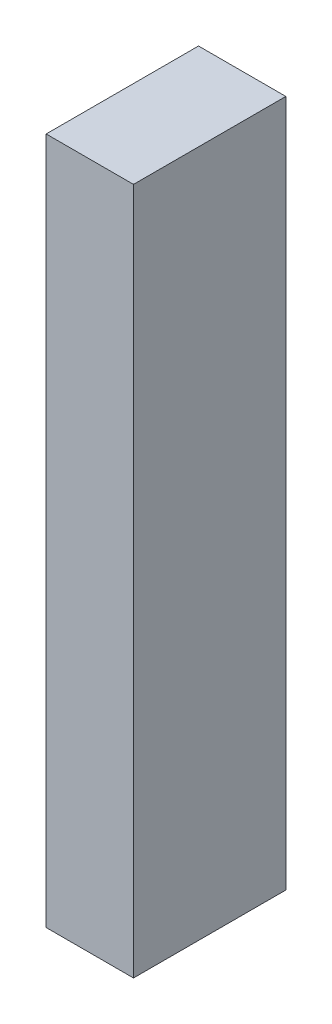
ISO-10303-21;
HEADER;
FILE_DESCRIPTION(('STEP AP214'),'2;1');
FILE_NAME('part.step','',(''),(''),'','','');
FILE_SCHEMA(('AUTOMOTIVE_DESIGN { 1 0 10303 214 1 1 1 1 }'));
ENDSEC;
DATA;
#1=APPLICATION_CONTEXT('core data for automotive mechanical design processes');
#2=APPLICATION_PROTOCOL_DEFINITION('international standard','automotive_design',2000,#1);
#3=PRODUCT_CONTEXT('',#1,'mechanical');
#4=PRODUCT('Part','Part','',(#3));
#5=PRODUCT_RELATED_PRODUCT_CATEGORY('part','',(#4));
#6=PRODUCT_DEFINITION_FORMATION('','',#4);
#7=PRODUCT_DEFINITION_CONTEXT('part definition',#1,'design');
#8=PRODUCT_DEFINITION('design','',#6,#7);
#9=PRODUCT_DEFINITION_SHAPE('','',#8);
#10=(LENGTH_UNIT() NAMED_UNIT(*) SI_UNIT(.MILLI.,.METRE.));
#11=(NAMED_UNIT(*) PLANE_ANGLE_UNIT() SI_UNIT($,.RADIAN.));
#12=(NAMED_UNIT(*) SI_UNIT($,.STERADIAN.) SOLID_ANGLE_UNIT());
#13=UNCERTAINTY_MEASURE_WITH_UNIT(LENGTH_MEASURE(1.E-05),#10,'distance_accuracy_value','');
#14=(GEOMETRIC_REPRESENTATION_CONTEXT(3) GLOBAL_UNCERTAINTY_ASSIGNED_CONTEXT((#13)) GLOBAL_UNIT_ASSIGNED_CONTEXT((#10,
#11,#12)) REPRESENTATION_CONTEXT('',''));
#15=CARTESIAN_POINT('',(0.,0.,0.));
#16=DIRECTION('',(0.,0.,1.));
#17=DIRECTION('',(1.,0.,0.));
#18=AXIS2_PLACEMENT_3D('',#15,#16,#17);
#19=CARTESIAN_POINT('',(-2.465,19.4,8.6));
#20=DIRECTION('',(1.,0.,0.));
#21=DIRECTION('',(0.,1.,0.));
#22=AXIS2_PLACEMENT_3D('',#19,#20,#21);
#23=PLANE('',#22);
#24=DIRECTION('',(0.,-1.,0.));
#25=VECTOR('',#24,1.);
#26=CARTESIAN_POINT('',(-2.465,19.4,0.));
#27=LINE('',#26,#25);
#28=CARTESIAN_POINT('',(-2.465,19.4,0.));
#29=VERTEX_POINT('',#28);
#30=CARTESIAN_POINT('',(-2.465,-19.4,0.));
#31=VERTEX_POINT('',#30);
#32=EDGE_CURVE('E95',#29,#31,#27,.T.);
#33=ORIENTED_EDGE('',*,*,#32,.T.);
#34=DIRECTION('',(0.,0.,-1.));
#35=VECTOR('',#34,1.);
#36=CARTESIAN_POINT('',(-2.465,-19.4,8.6));
#37=LINE('',#36,#35);
#38=CARTESIAN_POINT('',(-2.465,-19.4,8.6));
#39=VERTEX_POINT('',#38);
#40=EDGE_CURVE('E11',#39,#31,#37,.T.);
#41=ORIENTED_EDGE('',*,*,#40,.F.);
#42=DIRECTION('',(0.,-1.,0.));
#43=VECTOR('',#42,1.);
#44=CARTESIAN_POINT('',(-2.465,19.4,8.6));
#45=LINE('',#44,#43);
#46=CARTESIAN_POINT('',(-2.465,19.4,8.6));
#47=VERTEX_POINT('',#46);
#48=EDGE_CURVE('E83',#47,#39,#45,.T.);
#49=ORIENTED_EDGE('',*,*,#48,.F.);
#50=DIRECTION('',(0.,0.,-1.));
#51=VECTOR('',#50,1.);
#52=CARTESIAN_POINT('',(-2.465,19.4,8.6));
#53=LINE('',#52,#51);
#54=EDGE_CURVE('E91',#47,#29,#53,.T.);
#55=ORIENTED_EDGE('',*,*,#54,.T.);
#56=EDGE_LOOP('',(#33,#41,#49,#55));
#57=FACE_BOUND('',#56,.T.);
#58=ADVANCED_FACE('F32',(#57),#23,.F.);
#59=CARTESIAN_POINT('',(2.465,-19.4,8.6));
#60=DIRECTION('',(0.,1.,0.));
#61=DIRECTION('',(0.,0.,1.));
#62=AXIS2_PLACEMENT_3D('',#59,#60,#61);
#63=PLANE('',#62);
#64=DIRECTION('',(1.,0.,0.));
#65=VECTOR('',#64,1.);
#66=CARTESIAN_POINT('',(2.465,-19.4,0.));
#67=LINE('',#66,#65);
#68=CARTESIAN_POINT('',(2.465,-19.4,0.));
#69=VERTEX_POINT('',#68);
#70=EDGE_CURVE('E87',#31,#69,#67,.T.);
#71=ORIENTED_EDGE('',*,*,#70,.T.);
#72=DIRECTION('',(0.,0.,-1.));
#73=VECTOR('',#72,1.);
#74=CARTESIAN_POINT('',(2.465,-19.4,8.6));
#75=LINE('',#74,#73);
#76=CARTESIAN_POINT('',(2.465,-19.4,8.6));
#77=VERTEX_POINT('',#76);
#78=EDGE_CURVE('E40',#77,#69,#75,.T.);
#79=ORIENTED_EDGE('',*,*,#78,.F.);
#80=DIRECTION('',(1.,0.,0.));
#81=VECTOR('',#80,1.);
#82=CARTESIAN_POINT('',(2.465,-19.4,8.6));
#83=LINE('',#82,#81);
#84=EDGE_CURVE('E78',#39,#77,#83,.T.);
#85=ORIENTED_EDGE('',*,*,#84,.F.);
#86=ORIENTED_EDGE('',*,*,#40,.T.);
#87=EDGE_LOOP('',(#71,#79,#85,#86));
#88=FACE_BOUND('',#87,.T.);
#89=ADVANCED_FACE('F86',(#88),#63,.F.);
#90=CARTESIAN_POINT('',(2.465,19.4,8.6));
#91=DIRECTION('',(-1.,0.,0.));
#92=DIRECTION('',(0.,-1.,0.));
#93=AXIS2_PLACEMENT_3D('',#90,#91,#92);
#94=PLANE('',#93);
#95=DIRECTION('',(0.,1.,0.));
#96=VECTOR('',#95,1.);
#97=CARTESIAN_POINT('',(2.465,19.4,0.));
#98=LINE('',#97,#96);
#99=CARTESIAN_POINT('',(2.465,19.4,0.));
#100=VERTEX_POINT('',#99);
#101=EDGE_CURVE('E65',#69,#100,#98,.T.);
#102=ORIENTED_EDGE('',*,*,#101,.T.);
#103=DIRECTION('',(0.,0.,-1.));
#104=VECTOR('',#103,1.);
#105=CARTESIAN_POINT('',(2.465,19.4,8.6));
#106=LINE('',#105,#104);
#107=CARTESIAN_POINT('',(2.465,19.4,8.6));
#108=VERTEX_POINT('',#107);
#109=EDGE_CURVE('E88',#108,#100,#106,.T.);
#110=ORIENTED_EDGE('',*,*,#109,.F.);
#111=DIRECTION('',(0.,1.,0.));
#112=VECTOR('',#111,1.);
#113=CARTESIAN_POINT('',(2.465,19.4,8.6));
#114=LINE('',#113,#112);
#115=EDGE_CURVE('E81',#77,#108,#114,.T.);
#116=ORIENTED_EDGE('',*,*,#115,.F.);
#117=ORIENTED_EDGE('',*,*,#78,.T.);
#118=EDGE_LOOP('',(#102,#110,#116,#117));
#119=FACE_BOUND('',#118,.T.);
#120=ADVANCED_FACE('F89',(#119),#94,.F.);
#121=CARTESIAN_POINT('',(2.465,19.4,8.6));
#122=DIRECTION('',(0.,-1.,0.));
#123=DIRECTION('',(0.,0.,-1.));
#124=AXIS2_PLACEMENT_3D('',#121,#122,#123);
#125=PLANE('',#124);
#126=DIRECTION('',(-1.,0.,0.));
#127=VECTOR('',#126,1.);
#128=CARTESIAN_POINT('',(2.465,19.4,0.));
#129=LINE('',#128,#127);
#130=EDGE_CURVE('E71',#100,#29,#129,.T.);
#131=ORIENTED_EDGE('',*,*,#130,.T.);
#132=ORIENTED_EDGE('',*,*,#54,.F.);
#133=DIRECTION('',(-1.,0.,0.));
#134=VECTOR('',#133,1.);
#135=CARTESIAN_POINT('',(2.465,19.4,8.6));
#136=LINE('',#135,#134);
#137=EDGE_CURVE('E48',#108,#47,#136,.T.);
#138=ORIENTED_EDGE('',*,*,#137,.F.);
#139=ORIENTED_EDGE('',*,*,#109,.T.);
#140=EDGE_LOOP('',(#131,#132,#138,#139));
#141=FACE_BOUND('',#140,.T.);
#142=ADVANCED_FACE('F102',(#141),#125,.F.);
#143=CARTESIAN_POINT('',(0.,0.,8.6));
#144=DIRECTION('',(0.,0.,-1.));
#145=DIRECTION('',(-1.,0.,0.));
#146=AXIS2_PLACEMENT_3D('',#143,#144,#145);
#147=PLANE('',#146);
#148=ORIENTED_EDGE('',*,*,#48,.T.);
#149=ORIENTED_EDGE('',*,*,#84,.T.);
#150=ORIENTED_EDGE('',*,*,#115,.T.);
#151=ORIENTED_EDGE('',*,*,#137,.T.);
#152=EDGE_LOOP('',(#148,#149,#150,#151));
#153=FACE_BOUND('',#152,.T.);
#154=ADVANCED_FACE('F79',(#153),#147,.F.);
#155=CARTESIAN_POINT('',(0.,0.,0.));
#156=DIRECTION('',(0.,0.,-1.));
#157=DIRECTION('',(-1.,0.,0.));
#158=AXIS2_PLACEMENT_3D('',#155,#156,#157);
#159=PLANE('',#158);
#160=ORIENTED_EDGE('',*,*,#32,.F.);
#161=ORIENTED_EDGE('',*,*,#130,.F.);
#162=ORIENTED_EDGE('',*,*,#101,.F.);
#163=ORIENTED_EDGE('',*,*,#70,.F.);
#164=EDGE_LOOP('',(#160,#161,#162,#163));
#165=FACE_BOUND('',#164,.T.);
#166=ADVANCED_FACE('F105',(#165),#159,.T.);
#167=CLOSED_SHELL('',(#58,#89,#120,#142,#154,#166));
#168=MANIFOLD_SOLID_BREP('B2',#167);
#169=ADVANCED_BREP_SHAPE_REPRESENTATION('',(#18,#168),#14);
#170=SHAPE_DEFINITION_REPRESENTATION(#9,#169);
ENDSEC;
END-ISO-10303-21;
